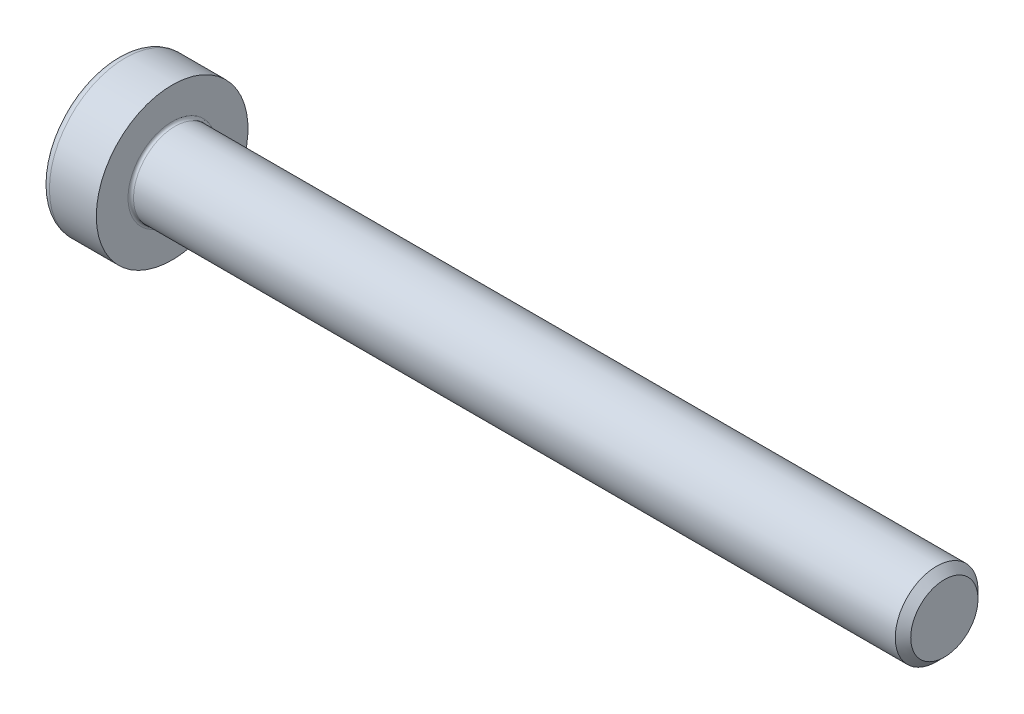
ISO-10303-21;
HEADER;
FILE_DESCRIPTION(('STEP AP214'),'2;1');
FILE_NAME('part.step','',(''),(''),'','','');
FILE_SCHEMA(('AUTOMOTIVE_DESIGN { 1 0 10303 214 1 1 1 1 }'));
ENDSEC;
DATA;
#1=APPLICATION_CONTEXT('core data for automotive mechanical design processes');
#2=APPLICATION_PROTOCOL_DEFINITION('international standard','automotive_design',2000,#1);
#3=PRODUCT_CONTEXT('',#1,'mechanical');
#4=PRODUCT('Part','Part','',(#3));
#5=PRODUCT_RELATED_PRODUCT_CATEGORY('part','',(#4));
#6=PRODUCT_DEFINITION_FORMATION('','',#4);
#7=PRODUCT_DEFINITION_CONTEXT('part definition',#1,'design');
#8=PRODUCT_DEFINITION('design','',#6,#7);
#9=PRODUCT_DEFINITION_SHAPE('','',#8);
#10=(LENGTH_UNIT() NAMED_UNIT(*) SI_UNIT(.MILLI.,.METRE.));
#11=(NAMED_UNIT(*) PLANE_ANGLE_UNIT() SI_UNIT($,.RADIAN.));
#12=(NAMED_UNIT(*) SI_UNIT($,.STERADIAN.) SOLID_ANGLE_UNIT());
#13=UNCERTAINTY_MEASURE_WITH_UNIT(LENGTH_MEASURE(1.E-05),#10,'distance_accuracy_value','');
#14=(GEOMETRIC_REPRESENTATION_CONTEXT(3) GLOBAL_UNCERTAINTY_ASSIGNED_CONTEXT((#13)) GLOBAL_UNIT_ASSIGNED_CONTEXT((#10,
#11,#12)) REPRESENTATION_CONTEXT('',''));
#15=CARTESIAN_POINT('',(0.,0.,0.));
#16=DIRECTION('',(0.,0.,1.));
#17=DIRECTION('',(1.,0.,0.));
#18=AXIS2_PLACEMENT_3D('',#15,#16,#17);
#19=CARTESIAN_POINT('',(0.,0.,0.));
#20=DIRECTION('',(-1.,0.,0.));
#21=DIRECTION('',(0.,0.,1.));
#22=AXIS2_PLACEMENT_3D('',#19,#20,#21);
#23=PLANE('',#22);
#24=DIRECTION('',(0.,-0.499999999999998,0.86602540378444));
#25=VECTOR('',#24,1.);
#26=CARTESIAN_POINT('',(0.,1.15470053837926,0.));
#27=LINE('',#26,#25);
#28=CARTESIAN_POINT('',(0.,1.15470053837926,0.));
#29=VERTEX_POINT('',#28);
#30=CARTESIAN_POINT('',(0.,0.577350269189634,0.999999999999994));
#31=VERTEX_POINT('',#30);
#32=EDGE_CURVE('E257',#29,#31,#27,.T.);
#33=ORIENTED_EDGE('',*,*,#32,.T.);
#34=DIRECTION('',(0.,1.,0.));
#35=VECTOR('',#34,1.);
#36=CARTESIAN_POINT('',(0.,-0.577350269189617,0.999999999999996));
#37=LINE('',#36,#35);
#38=CARTESIAN_POINT('',(0.,-0.577350269189617,0.999999999999996));
#39=VERTEX_POINT('',#38);
#40=EDGE_CURVE('E129',#39,#31,#37,.T.);
#41=ORIENTED_EDGE('',*,*,#40,.F.);
#42=DIRECTION('',(0.,-0.500000000000001,-0.866025403784438));
#43=VECTOR('',#42,1.);
#44=CARTESIAN_POINT('',(0.,-0.577350269189617,0.999999999999996));
#45=LINE('',#44,#43);
#46=CARTESIAN_POINT('',(0.,-1.15470053837924,0.));
#47=VERTEX_POINT('',#46);
#48=EDGE_CURVE('E260',#39,#47,#45,.T.);
#49=ORIENTED_EDGE('',*,*,#48,.T.);
#50=DIRECTION('',(0.,0.499999999999997,-0.86602540378444));
#51=VECTOR('',#50,1.);
#52=CARTESIAN_POINT('',(0.,-1.15470053837924,0.));
#53=LINE('',#52,#51);
#54=CARTESIAN_POINT('',(0.,-0.577350269189621,-1.));
#55=VERTEX_POINT('',#54);
#56=EDGE_CURVE('E263',#47,#55,#53,.T.);
#57=ORIENTED_EDGE('',*,*,#56,.T.);
#58=DIRECTION('',(0.,-1.,0.));
#59=VECTOR('',#58,1.);
#60=CARTESIAN_POINT('',(0.,0.57735026918963,-1.00000000000001));
#61=LINE('',#60,#59);
#62=CARTESIAN_POINT('',(0.,0.57735026918963,-1.00000000000001));
#63=VERTEX_POINT('',#62);
#64=EDGE_CURVE('E266',#63,#55,#61,.T.);
#65=ORIENTED_EDGE('',*,*,#64,.F.);
#66=DIRECTION('',(0.,-0.500000000000001,-0.866025403784438));
#67=VECTOR('',#66,1.);
#68=CARTESIAN_POINT('',(0.,1.15470053837926,0.));
#69=LINE('',#68,#67);
#70=EDGE_CURVE('E124',#29,#63,#69,.T.);
#71=ORIENTED_EDGE('',*,*,#70,.F.);
#72=EDGE_LOOP('',(#33,#41,#49,#57,#65,#71));
#73=FACE_BOUND('',#72,.T.);
#74=CARTESIAN_POINT('',(0.,0.,0.));
#75=DIRECTION('',(-1.,0.,0.));
#76=DIRECTION('',(0.,0.,1.));
#77=AXIS2_PLACEMENT_3D('',#74,#75,#76);
#78=CIRCLE('',#77,2.45);
#79=CARTESIAN_POINT('',(0.,0.,2.45));
#80=VERTEX_POINT('',#79);
#81=EDGE_CURVE('E41',#80,#80,#78,.T.);
#82=ORIENTED_EDGE('',*,*,#81,.T.);
#83=EDGE_LOOP('',(#82));
#84=FACE_BOUND('',#83,.T.);
#85=ADVANCED_FACE('F33',(#73,#84),#23,.T.);
#86=CARTESIAN_POINT('',(-31.75,0.,0.));
#87=DIRECTION('',(-1.,0.,0.));
#88=DIRECTION('',(0.,0.,1.));
#89=AXIS2_PLACEMENT_3D('',#86,#87,#88);
#90=CYLINDRICAL_SURFACE('',#89,2.75);
#91=CARTESIAN_POINT('',(0.300000000000002,0.,0.));
#92=DIRECTION('',(-1.,0.,0.));
#93=DIRECTION('',(0.,0.,1.));
#94=AXIS2_PLACEMENT_3D('',#91,#92,#93);
#95=CIRCLE('',#94,2.75);
#96=CARTESIAN_POINT('',(0.300000000000002,0.,2.75));
#97=VERTEX_POINT('',#96);
#98=EDGE_CURVE('E11',#97,#97,#95,.F.);
#99=ORIENTED_EDGE('',*,*,#98,.T.);
#100=EDGE_LOOP('',(#99));
#101=FACE_BOUND('',#100,.T.);
#102=CARTESIAN_POINT('',(2.,0.,0.));
#103=DIRECTION('',(-1.,0.,0.));
#104=DIRECTION('',(0.,0.,1.));
#105=AXIS2_PLACEMENT_3D('',#102,#103,#104);
#106=CIRCLE('',#105,2.75);
#107=CARTESIAN_POINT('',(2.,0.,2.75));
#108=VERTEX_POINT('',#107);
#109=EDGE_CURVE('E147',#108,#108,#106,.T.);
#110=ORIENTED_EDGE('',*,*,#109,.T.);
#111=EDGE_LOOP('',(#110));
#112=FACE_BOUND('',#111,.T.);
#113=ADVANCED_FACE('F171',(#101,#112),#90,.T.);
#114=CARTESIAN_POINT('',(2.,2.75,0.));
#115=DIRECTION('',(1.,0.,0.));
#116=DIRECTION('',(0.,0.,-1.));
#117=AXIS2_PLACEMENT_3D('',#114,#115,#116);
#118=PLANE('',#117);
#119=CARTESIAN_POINT('',(2.,0.,0.));
#120=DIRECTION('',(1.,0.,0.));
#121=DIRECTION('',(0.,0.,-1.));
#122=AXIS2_PLACEMENT_3D('',#119,#120,#121);
#123=CIRCLE('',#122,1.59999999999986);
#124=CARTESIAN_POINT('',(2.,0.,-1.59999999999986));
#125=VERTEX_POINT('',#124);
#126=EDGE_CURVE('E150',#125,#125,#123,.F.);
#127=ORIENTED_EDGE('',*,*,#126,.T.);
#128=EDGE_LOOP('',(#127));
#129=FACE_BOUND('',#128,.T.);
#130=ORIENTED_EDGE('',*,*,#109,.F.);
#131=EDGE_LOOP('',(#130));
#132=FACE_BOUND('',#131,.T.);
#133=ADVANCED_FACE('F177',(#129,#132),#118,.T.);
#134=CARTESIAN_POINT('',(-31.75,0.,0.));
#135=DIRECTION('',(-1.,0.,0.));
#136=DIRECTION('',(0.,0.,1.));
#137=AXIS2_PLACEMENT_3D('',#134,#135,#136);
#138=CYLINDRICAL_SURFACE('',#137,1.49999999999986);
#139=CARTESIAN_POINT('',(2.1,0.,0.));
#140=DIRECTION('',(1.,0.,0.));
#141=DIRECTION('',(0.,0.,-1.));
#142=AXIS2_PLACEMENT_3D('',#139,#140,#141);
#143=CIRCLE('',#142,1.49999999999986);
#144=CARTESIAN_POINT('',(2.1,0.,-1.49999999999986));
#145=VERTEX_POINT('',#144);
#146=EDGE_CURVE('E153',#145,#145,#143,.T.);
#147=ORIENTED_EDGE('',*,*,#146,.T.);
#148=EDGE_LOOP('',(#147));
#149=FACE_BOUND('',#148,.T.);
#150=CARTESIAN_POINT('',(29.7194999999997,0.,0.));
#151=DIRECTION('',(-1.,0.,0.));
#152=DIRECTION('',(0.,0.,1.));
#153=AXIS2_PLACEMENT_3D('',#150,#151,#152);
#154=CIRCLE('',#153,1.49999999999972);
#155=CARTESIAN_POINT('',(29.7194999999997,0.,1.49999999999972));
#156=VERTEX_POINT('',#155);
#157=EDGE_CURVE('E144',#156,#156,#154,.T.);
#158=ORIENTED_EDGE('',*,*,#157,.T.);
#159=EDGE_LOOP('',(#158));
#160=FACE_BOUND('',#159,.T.);
#161=ADVANCED_FACE('F183',(#149,#160),#138,.T.);
#162=CARTESIAN_POINT('',(30.,0.,0.));
#163=DIRECTION('',(-1.,0.,0.));
#164=DIRECTION('',(0.,0.,1.));
#165=AXIS2_PLACEMENT_3D('',#162,#163,#164);
#166=CONICAL_SURFACE('',#165,1.2195,0.785398163396447);
#167=ORIENTED_EDGE('',*,*,#157,.F.);
#168=EDGE_LOOP('',(#167));
#169=FACE_BOUND('',#168,.T.);
#170=CARTESIAN_POINT('',(30.,0.,0.));
#171=DIRECTION('',(-1.,0.,0.));
#172=DIRECTION('',(0.,0.,1.));
#173=AXIS2_PLACEMENT_3D('',#170,#171,#172);
#174=CIRCLE('',#173,1.2195);
#175=CARTESIAN_POINT('',(30.,0.,1.2195));
#176=VERTEX_POINT('',#175);
#177=EDGE_CURVE('E140',#176,#176,#174,.T.);
#178=ORIENTED_EDGE('',*,*,#177,.T.);
#179=EDGE_LOOP('',(#178));
#180=FACE_BOUND('',#179,.T.);
#181=ADVANCED_FACE('F187',(#169,#180),#166,.T.);
#182=CARTESIAN_POINT('',(30.,1.2195,0.));
#183=DIRECTION('',(1.,0.,0.));
#184=DIRECTION('',(0.,0.,-1.));
#185=AXIS2_PLACEMENT_3D('',#182,#183,#184);
#186=PLANE('',#185);
#187=ORIENTED_EDGE('',*,*,#177,.F.);
#188=EDGE_LOOP('',(#187));
#189=FACE_BOUND('',#188,.T.);
#190=ADVANCED_FACE('F167',(#189),#186,.T.);
#191=CARTESIAN_POINT('',(2.1,0.,0.));
#192=DIRECTION('',(1.,0.,0.));
#193=DIRECTION('',(0.,0.,-1.));
#194=AXIS2_PLACEMENT_3D('',#191,#192,#193);
#195=TOROIDAL_SURFACE('',#194,1.59999999999986,0.1);
#196=ORIENTED_EDGE('',*,*,#146,.F.);
#197=EDGE_LOOP('',(#196));
#198=FACE_BOUND('',#197,.T.);
#199=ORIENTED_EDGE('',*,*,#126,.F.);
#200=EDGE_LOOP('',(#199));
#201=FACE_BOUND('',#200,.T.);
#202=ADVANCED_FACE('F160',(#198,#201),#195,.F.);
#203=CARTESIAN_POINT('',(0.300000000000002,0.,0.));
#204=DIRECTION('',(-1.,0.,0.));
#205=DIRECTION('',(0.,0.,1.));
#206=AXIS2_PLACEMENT_3D('',#203,#204,#205);
#207=TOROIDAL_SURFACE('',#206,2.45,0.3);
#208=ORIENTED_EDGE('',*,*,#98,.F.);
#209=EDGE_LOOP('',(#208));
#210=FACE_BOUND('',#209,.T.);
#211=ORIENTED_EDGE('',*,*,#81,.F.);
#212=EDGE_LOOP('',(#211));
#213=FACE_BOUND('',#212,.T.);
#214=ADVANCED_FACE('F35',(#210,#213),#207,.T.);
#215=CARTESIAN_POINT('',(1.5,1.15470053837926,0.));
#216=DIRECTION('',(0.,-0.86602540378444,-0.499999999999998));
#217=DIRECTION('',(0.,0.499999999999998,-0.86602540378444));
#218=AXIS2_PLACEMENT_3D('',#215,#216,#217);
#219=PLANE('',#218);
#220=ORIENTED_EDGE('',*,*,#32,.F.);
#221=DIRECTION('',(-1.,0.,0.));
#222=VECTOR('',#221,1.);
#223=CARTESIAN_POINT('',(1.5,1.15470053837926,0.));
#224=LINE('',#223,#222);
#225=CARTESIAN_POINT('',(1.5,1.15470053837926,0.));
#226=VERTEX_POINT('',#225);
#227=EDGE_CURVE('E247',#226,#29,#224,.T.);
#228=ORIENTED_EDGE('',*,*,#227,.F.);
#229=DIRECTION('',(0.,-0.499999999999998,0.86602540378444));
#230=VECTOR('',#229,1.);
#231=CARTESIAN_POINT('',(1.5,1.15470053837926,0.));
#232=LINE('',#231,#230);
#233=CARTESIAN_POINT('',(1.5,0.866025403784442,0.499999999999999));
#234=VERTEX_POINT('',#233);
#235=EDGE_CURVE('E116',#226,#234,#232,.T.);
#236=ORIENTED_EDGE('',*,*,#235,.T.);
#237=CARTESIAN_POINT('',(1.5,0.577350269189634,0.999999999999994));
#238=VERTEX_POINT('',#237);
#239=EDGE_CURVE('E107',#234,#238,#232,.T.);
#240=ORIENTED_EDGE('',*,*,#239,.T.);
#241=DIRECTION('',(-1.,0.,0.));
#242=VECTOR('',#241,1.);
#243=CARTESIAN_POINT('',(1.5,0.577350269189634,0.999999999999994));
#244=LINE('',#243,#242);
#245=EDGE_CURVE('E121',#238,#31,#244,.T.);
#246=ORIENTED_EDGE('',*,*,#245,.T.);
#247=EDGE_LOOP('',(#220,#228,#236,#240,#246));
#248=FACE_BOUND('',#247,.T.);
#249=ADVANCED_FACE('F120',(#248),#219,.T.);
#250=CARTESIAN_POINT('',(1.5,-0.577350269189617,0.999999999999996));
#251=DIRECTION('',(0.,0.,1.));
#252=DIRECTION('',(0.,-1.,0.));
#253=AXIS2_PLACEMENT_3D('',#250,#251,#252);
#254=PLANE('',#253);
#255=ORIENTED_EDGE('',*,*,#40,.T.);
#256=ORIENTED_EDGE('',*,*,#245,.F.);
#257=DIRECTION('',(0.,1.,0.));
#258=VECTOR('',#257,1.);
#259=CARTESIAN_POINT('',(1.5,-0.577350269189617,0.999999999999996));
#260=LINE('',#259,#258);
#261=CARTESIAN_POINT('',(1.5,0.,0.999999999999995));
#262=VERTEX_POINT('',#261);
#263=EDGE_CURVE('E104',#262,#238,#260,.T.);
#264=ORIENTED_EDGE('',*,*,#263,.F.);
#265=CARTESIAN_POINT('',(1.5,-0.577350269189617,0.999999999999996));
#266=VERTEX_POINT('',#265);
#267=EDGE_CURVE('E115',#266,#262,#260,.T.);
#268=ORIENTED_EDGE('',*,*,#267,.F.);
#269=DIRECTION('',(-1.,0.,0.));
#270=VECTOR('',#269,1.);
#271=CARTESIAN_POINT('',(1.5,-0.577350269189617,0.999999999999996));
#272=LINE('',#271,#270);
#273=EDGE_CURVE('E131',#266,#39,#272,.T.);
#274=ORIENTED_EDGE('',*,*,#273,.T.);
#275=EDGE_LOOP('',(#255,#256,#264,#268,#274));
#276=FACE_BOUND('',#275,.T.);
#277=ADVANCED_FACE('F126',(#276),#254,.F.);
#278=CARTESIAN_POINT('',(1.5,-0.577350269189617,0.999999999999996));
#279=DIRECTION('',(0.,0.866025403784438,-0.500000000000001));
#280=DIRECTION('',(0.,0.500000000000001,0.866025403784438));
#281=AXIS2_PLACEMENT_3D('',#278,#279,#280);
#282=PLANE('',#281);
#283=ORIENTED_EDGE('',*,*,#48,.F.);
#284=ORIENTED_EDGE('',*,*,#273,.F.);
#285=DIRECTION('',(0.,-0.500000000000001,-0.866025403784438));
#286=VECTOR('',#285,1.);
#287=CARTESIAN_POINT('',(1.5,-0.577350269189617,0.999999999999996));
#288=LINE('',#287,#286);
#289=CARTESIAN_POINT('',(1.5,-0.86602540378443,0.499999999999997));
#290=VERTEX_POINT('',#289);
#291=EDGE_CURVE('E286',#266,#290,#288,.T.);
#292=ORIENTED_EDGE('',*,*,#291,.T.);
#293=CARTESIAN_POINT('',(1.5,-1.15470053837924,0.));
#294=VERTEX_POINT('',#293);
#295=EDGE_CURVE('E275',#290,#294,#288,.T.);
#296=ORIENTED_EDGE('',*,*,#295,.T.);
#297=DIRECTION('',(-1.,0.,0.));
#298=VECTOR('',#297,1.);
#299=CARTESIAN_POINT('',(1.5,-1.15470053837924,0.));
#300=LINE('',#299,#298);
#301=EDGE_CURVE('E136',#294,#47,#300,.T.);
#302=ORIENTED_EDGE('',*,*,#301,.T.);
#303=EDGE_LOOP('',(#283,#284,#292,#296,#302));
#304=FACE_BOUND('',#303,.T.);
#305=ADVANCED_FACE('F201',(#304),#282,.T.);
#306=CARTESIAN_POINT('',(1.5,-1.15470053837924,0.));
#307=DIRECTION('',(0.,0.86602540378444,0.499999999999998));
#308=DIRECTION('',(0.,-0.499999999999998,0.86602540378444));
#309=AXIS2_PLACEMENT_3D('',#306,#307,#308);
#310=PLANE('',#309);
#311=ORIENTED_EDGE('',*,*,#56,.F.);
#312=ORIENTED_EDGE('',*,*,#301,.F.);
#313=DIRECTION('',(0.,0.499999999999997,-0.86602540378444));
#314=VECTOR('',#313,1.);
#315=CARTESIAN_POINT('',(1.5,-1.15470053837924,0.));
#316=LINE('',#315,#314);
#317=CARTESIAN_POINT('',(1.5,-0.866025403784436,-0.499999999999995));
#318=VERTEX_POINT('',#317);
#319=EDGE_CURVE('E253',#294,#318,#316,.T.);
#320=ORIENTED_EDGE('',*,*,#319,.T.);
#321=CARTESIAN_POINT('',(1.5,-0.577350269189621,-1.));
#322=VERTEX_POINT('',#321);
#323=EDGE_CURVE('E285',#318,#322,#316,.T.);
#324=ORIENTED_EDGE('',*,*,#323,.T.);
#325=DIRECTION('',(-1.,0.,0.));
#326=VECTOR('',#325,1.);
#327=CARTESIAN_POINT('',(1.5,-0.577350269189621,-1.));
#328=LINE('',#327,#326);
#329=EDGE_CURVE('E246',#322,#55,#328,.T.);
#330=ORIENTED_EDGE('',*,*,#329,.T.);
#331=EDGE_LOOP('',(#311,#312,#320,#324,#330));
#332=FACE_BOUND('',#331,.T.);
#333=ADVANCED_FACE('F204',(#332),#310,.T.);
#334=CARTESIAN_POINT('',(1.5,0.57735026918963,-1.00000000000001));
#335=DIRECTION('',(0.,0.,-1.));
#336=DIRECTION('',(0.,1.,0.));
#337=AXIS2_PLACEMENT_3D('',#334,#335,#336);
#338=PLANE('',#337);
#339=ORIENTED_EDGE('',*,*,#64,.T.);
#340=ORIENTED_EDGE('',*,*,#329,.F.);
#341=DIRECTION('',(0.,-1.,0.));
#342=VECTOR('',#341,1.);
#343=CARTESIAN_POINT('',(1.5,0.57735026918963,-1.00000000000001));
#344=LINE('',#343,#342);
#345=CARTESIAN_POINT('',(1.5,0.,-1.));
#346=VERTEX_POINT('',#345);
#347=EDGE_CURVE('E250',#346,#322,#344,.T.);
#348=ORIENTED_EDGE('',*,*,#347,.F.);
#349=CARTESIAN_POINT('',(1.5,0.57735026918963,-1.00000000000001));
#350=VERTEX_POINT('',#349);
#351=EDGE_CURVE('E48',#350,#346,#344,.T.);
#352=ORIENTED_EDGE('',*,*,#351,.F.);
#353=DIRECTION('',(-1.,0.,0.));
#354=VECTOR('',#353,1.);
#355=CARTESIAN_POINT('',(1.5,0.57735026918963,-1.00000000000001));
#356=LINE('',#355,#354);
#357=EDGE_CURVE('E243',#350,#63,#356,.T.);
#358=ORIENTED_EDGE('',*,*,#357,.T.);
#359=EDGE_LOOP('',(#339,#340,#348,#352,#358));
#360=FACE_BOUND('',#359,.T.);
#361=ADVANCED_FACE('F208',(#360),#338,.F.);
#362=CARTESIAN_POINT('',(1.5,1.15470053837926,0.));
#363=DIRECTION('',(0.,0.866025403784438,-0.500000000000001));
#364=DIRECTION('',(0.,0.500000000000001,0.866025403784438));
#365=AXIS2_PLACEMENT_3D('',#362,#363,#364);
#366=PLANE('',#365);
#367=ORIENTED_EDGE('',*,*,#70,.T.);
#368=ORIENTED_EDGE('',*,*,#357,.F.);
#369=DIRECTION('',(0.,-0.500000000000001,-0.866025403784438));
#370=VECTOR('',#369,1.);
#371=CARTESIAN_POINT('',(1.5,1.15470053837926,0.));
#372=LINE('',#371,#370);
#373=CARTESIAN_POINT('',(1.5,0.866025403784445,-0.500000000000005));
#374=VERTEX_POINT('',#373);
#375=EDGE_CURVE('E233',#374,#350,#372,.T.);
#376=ORIENTED_EDGE('',*,*,#375,.F.);
#377=EDGE_CURVE('E239',#226,#374,#372,.T.);
#378=ORIENTED_EDGE('',*,*,#377,.F.);
#379=ORIENTED_EDGE('',*,*,#227,.T.);
#380=EDGE_LOOP('',(#367,#368,#376,#378,#379));
#381=FACE_BOUND('',#380,.T.);
#382=ADVANCED_FACE('F212',(#381),#366,.F.);
#383=CARTESIAN_POINT('',(1.5,1.73205080756888,-1.00000000000001));
#384=DIRECTION('',(1.,0.,0.));
#385=DIRECTION('',(0.,0.,-1.));
#386=AXIS2_PLACEMENT_3D('',#383,#384,#385);
#387=PLANE('',#386);
#388=ORIENTED_EDGE('',*,*,#347,.T.);
#389=ORIENTED_EDGE('',*,*,#323,.F.);
#390=CARTESIAN_POINT('',(1.5,0.,0.));
#391=DIRECTION('',(-1.,0.,0.));
#392=DIRECTION('',(0.,0.,1.));
#393=AXIS2_PLACEMENT_3D('',#390,#391,#392);
#394=CIRCLE('',#393,1.);
#395=EDGE_CURVE('E281',#346,#318,#394,.T.);
#396=ORIENTED_EDGE('',*,*,#395,.F.);
#397=EDGE_LOOP('',(#388,#389,#396));
#398=FACE_BOUND('',#397,.T.);
#399=ADVANCED_FACE('F216',(#398),#387,.F.);
#400=ORIENTED_EDGE('',*,*,#319,.F.);
#401=ORIENTED_EDGE('',*,*,#295,.F.);
#402=EDGE_CURVE('E134',#318,#290,#394,.T.);
#403=ORIENTED_EDGE('',*,*,#402,.F.);
#404=EDGE_LOOP('',(#400,#401,#403));
#405=FACE_BOUND('',#404,.T.);
#406=ADVANCED_FACE('F219',(#405),#387,.F.);
#407=ORIENTED_EDGE('',*,*,#291,.F.);
#408=ORIENTED_EDGE('',*,*,#267,.T.);
#409=EDGE_CURVE('E130',#290,#262,#394,.T.);
#410=ORIENTED_EDGE('',*,*,#409,.F.);
#411=EDGE_LOOP('',(#407,#408,#410));
#412=FACE_BOUND('',#411,.T.);
#413=ADVANCED_FACE('F224',(#412),#387,.F.);
#414=ORIENTED_EDGE('',*,*,#263,.T.);
#415=ORIENTED_EDGE('',*,*,#239,.F.);
#416=EDGE_CURVE('E110',#262,#234,#394,.T.);
#417=ORIENTED_EDGE('',*,*,#416,.F.);
#418=EDGE_LOOP('',(#414,#415,#417));
#419=FACE_BOUND('',#418,.T.);
#420=ADVANCED_FACE('F106',(#419),#387,.F.);
#421=ORIENTED_EDGE('',*,*,#235,.F.);
#422=ORIENTED_EDGE('',*,*,#377,.T.);
#423=EDGE_CURVE('E141',#234,#374,#394,.T.);
#424=ORIENTED_EDGE('',*,*,#423,.F.);
#425=EDGE_LOOP('',(#421,#422,#424));
#426=FACE_BOUND('',#425,.T.);
#427=ADVANCED_FACE('F227',(#426),#387,.F.);
#428=ORIENTED_EDGE('',*,*,#375,.T.);
#429=ORIENTED_EDGE('',*,*,#351,.T.);
#430=EDGE_CURVE('E236',#374,#346,#394,.T.);
#431=ORIENTED_EDGE('',*,*,#430,.F.);
#432=EDGE_LOOP('',(#428,#429,#431));
#433=FACE_BOUND('',#432,.T.);
#434=ADVANCED_FACE('F197',(#433),#387,.F.);
#435=CARTESIAN_POINT('',(1.5,0.,0.));
#436=DIRECTION('',(-1.,0.,0.));
#437=DIRECTION('',(0.,0.,1.));
#438=AXIS2_PLACEMENT_3D('',#435,#436,#437);
#439=CONICAL_SURFACE('',#438,1.,1.04719755119659);
#440=CARTESIAN_POINT('',(2.07735026918963,0.,0.));
#441=VERTEX_POINT('',#440);
#442=VERTEX_LOOP('',#441);
#443=FACE_BOUND('',#442,.T.);
#444=ORIENTED_EDGE('',*,*,#416,.T.);
#445=ORIENTED_EDGE('',*,*,#423,.T.);
#446=ORIENTED_EDGE('',*,*,#430,.T.);
#447=ORIENTED_EDGE('',*,*,#395,.T.);
#448=ORIENTED_EDGE('',*,*,#402,.T.);
#449=ORIENTED_EDGE('',*,*,#409,.T.);
#450=EDGE_LOOP('',(#444,#445,#446,#447,#448,#449));
#451=FACE_BOUND('',#450,.T.);
#452=ADVANCED_FACE('F195',(#443,#451),#439,.F.);
#453=CLOSED_SHELL('',(#85,#113,#133,#161,#181,#190,#202,#214,#249,#277,#305,#333,#361,#382,#399,
#406,#413,#420,#427,#434,#452));
#454=MANIFOLD_SOLID_BREP('B2',#453);
#455=ADVANCED_BREP_SHAPE_REPRESENTATION('',(#18,#454),#14);
#456=SHAPE_DEFINITION_REPRESENTATION(#9,#455);
ENDSEC;
END-ISO-10303-21;
